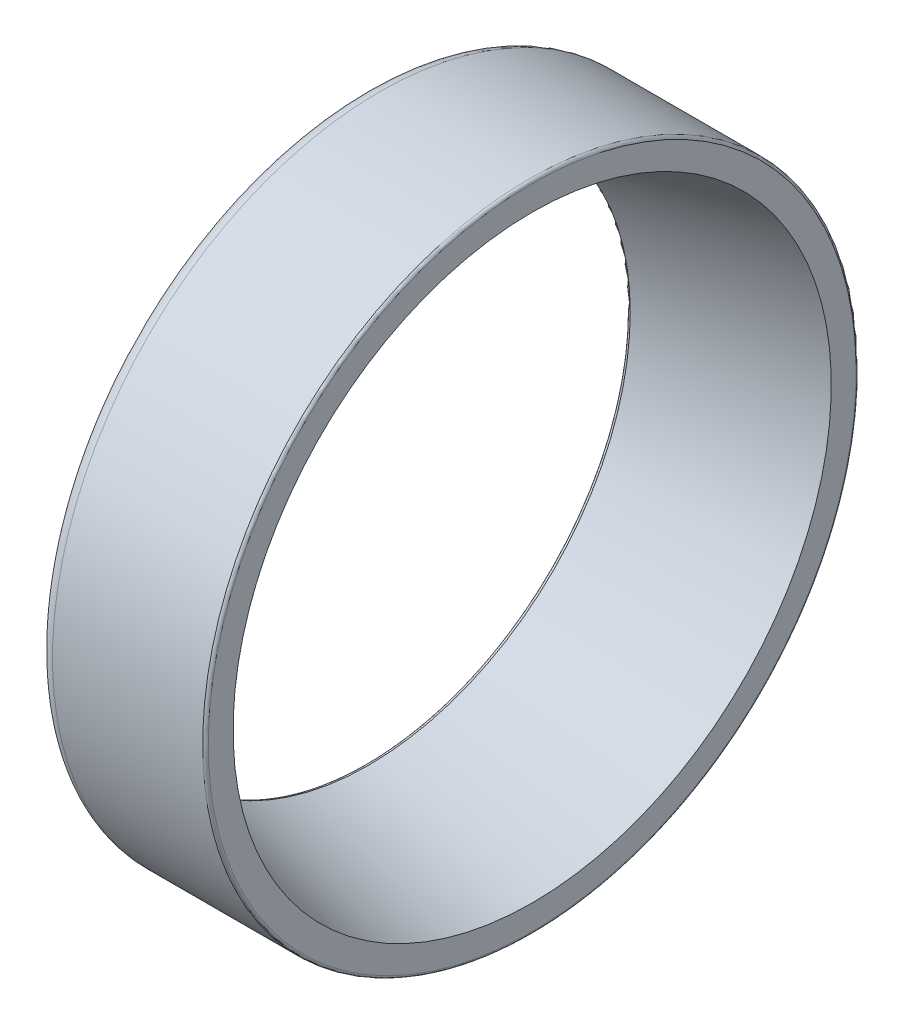
ISO-10303-21;
HEADER;
FILE_DESCRIPTION(('STEP AP214'),'2;1');
FILE_NAME('part.step','',(''),(''),'','','');
FILE_SCHEMA(('AUTOMOTIVE_DESIGN { 1 0 10303 214 1 1 1 1 }'));
ENDSEC;
DATA;
#1=APPLICATION_CONTEXT('core data for automotive mechanical design processes');
#2=APPLICATION_PROTOCOL_DEFINITION('international standard','automotive_design',2000,#1);
#3=PRODUCT_CONTEXT('',#1,'mechanical');
#4=PRODUCT('Part','Part','',(#3));
#5=PRODUCT_RELATED_PRODUCT_CATEGORY('part','',(#4));
#6=PRODUCT_DEFINITION_FORMATION('','',#4);
#7=PRODUCT_DEFINITION_CONTEXT('part definition',#1,'design');
#8=PRODUCT_DEFINITION('design','',#6,#7);
#9=PRODUCT_DEFINITION_SHAPE('','',#8);
#10=(LENGTH_UNIT() NAMED_UNIT(*) SI_UNIT(.MILLI.,.METRE.));
#11=(NAMED_UNIT(*) PLANE_ANGLE_UNIT() SI_UNIT($,.RADIAN.));
#12=(NAMED_UNIT(*) SI_UNIT($,.STERADIAN.) SOLID_ANGLE_UNIT());
#13=UNCERTAINTY_MEASURE_WITH_UNIT(LENGTH_MEASURE(1.E-05),#10,'distance_accuracy_value','');
#14=(GEOMETRIC_REPRESENTATION_CONTEXT(3) GLOBAL_UNCERTAINTY_ASSIGNED_CONTEXT((#13)) GLOBAL_UNIT_ASSIGNED_CONTEXT((#10,
#11,#12)) REPRESENTATION_CONTEXT('',''));
#15=CARTESIAN_POINT('',(0.,0.,0.));
#16=DIRECTION('',(0.,0.,1.));
#17=DIRECTION('',(1.,0.,0.));
#18=AXIS2_PLACEMENT_3D('',#15,#16,#17);
#19=CARTESIAN_POINT('',(0.2,0.,0.));
#20=DIRECTION('',(1.,0.,0.));
#21=DIRECTION('',(0.,0.,-1.));
#22=AXIS2_PLACEMENT_3D('',#19,#20,#21);
#23=TOROIDAL_SURFACE('',#22,19.0041538237628,0.2);
#24=CARTESIAN_POINT('',(0.244830339671573,0.,0.));
#25=DIRECTION('',(1.,0.,0.));
#26=DIRECTION('',(0.,1.,0.));
#27=AXIS2_PLACEMENT_3D('',#24,#25,#26);
#28=CIRCLE('',#27,18.8092429706916);
#29=CARTESIAN_POINT('',(0.244830339671573,18.8092429706916,0.));
#30=VERTEX_POINT('',#29);
#31=EDGE_CURVE('E11',#30,#30,#28,.T.);
#32=ORIENTED_EDGE('',*,*,#31,.T.);
#33=EDGE_LOOP('',(#32));
#34=FACE_BOUND('',#33,.T.);
#35=CARTESIAN_POINT('',(0.,0.,0.));
#36=DIRECTION('',(1.,0.,0.));
#37=DIRECTION('',(0.,1.,0.));
#38=AXIS2_PLACEMENT_3D('',#35,#36,#37);
#39=CIRCLE('',#38,19.0041538237628);
#40=CARTESIAN_POINT('',(0.,19.0041538237628,0.));
#41=VERTEX_POINT('',#40);
#42=EDGE_CURVE('E54',#41,#41,#39,.T.);
#43=ORIENTED_EDGE('',*,*,#42,.F.);
#44=EDGE_LOOP('',(#43));
#45=FACE_BOUND('',#44,.T.);
#46=ADVANCED_FACE('F16',(#34,#45),#23,.T.);
#47=CARTESIAN_POINT('',(6.12241516983579,0.,0.));
#48=DIRECTION('',(1.,0.,0.));
#49=DIRECTION('',(0.,1.,0.));
#50=AXIS2_PLACEMENT_3D('',#47,#48,#49);
#51=CONICAL_SURFACE('',#50,20.1611129165305,0.226072498010825);
#52=CARTESIAN_POINT('',(12.,0.,0.));
#53=DIRECTION('',(1.,0.,0.));
#54=DIRECTION('',(0.,1.,0.));
#55=AXIS2_PLACEMENT_3D('',#52,#53,#54);
#56=CIRCLE('',#55,21.5129828623694);
#57=CARTESIAN_POINT('',(12.,21.5129828623694,0.));
#58=VERTEX_POINT('',#57);
#59=EDGE_CURVE('E23',#58,#58,#56,.T.);
#60=ORIENTED_EDGE('',*,*,#59,.T.);
#61=EDGE_LOOP('',(#60));
#62=FACE_BOUND('',#61,.T.);
#63=ORIENTED_EDGE('',*,*,#31,.F.);
#64=EDGE_LOOP('',(#63));
#65=FACE_BOUND('',#64,.T.);
#66=ADVANCED_FACE('F77',(#62,#65),#51,.F.);
#67=CARTESIAN_POINT('',(12.,22.4064914311847,0.));
#68=DIRECTION('',(1.,0.,0.));
#69=DIRECTION('',(0.,1.,0.));
#70=AXIS2_PLACEMENT_3D('',#67,#68,#69);
#71=PLANE('',#70);
#72=CARTESIAN_POINT('',(12.,0.,0.));
#73=DIRECTION('',(1.,0.,0.));
#74=DIRECTION('',(0.,1.,0.));
#75=AXIS2_PLACEMENT_3D('',#72,#73,#74);
#76=CIRCLE('',#75,23.3);
#77=CARTESIAN_POINT('',(12.,23.3,0.));
#78=VERTEX_POINT('',#77);
#79=EDGE_CURVE('E51',#78,#78,#76,.T.);
#80=ORIENTED_EDGE('',*,*,#79,.T.);
#81=EDGE_LOOP('',(#80));
#82=FACE_BOUND('',#81,.T.);
#83=ORIENTED_EDGE('',*,*,#59,.F.);
#84=EDGE_LOOP('',(#83));
#85=FACE_BOUND('',#84,.T.);
#86=ADVANCED_FACE('F81',(#82,#85),#71,.T.);
#87=CARTESIAN_POINT('',(11.8,0.,0.));
#88=DIRECTION('',(1.,0.,0.));
#89=DIRECTION('',(0.,0.,-1.));
#90=AXIS2_PLACEMENT_3D('',#87,#88,#89);
#91=TOROIDAL_SURFACE('',#90,23.3,0.2);
#92=CARTESIAN_POINT('',(11.8,0.,0.));
#93=DIRECTION('',(1.,0.,0.));
#94=DIRECTION('',(0.,1.,0.));
#95=AXIS2_PLACEMENT_3D('',#92,#93,#94);
#96=CIRCLE('',#95,23.5);
#97=CARTESIAN_POINT('',(11.8,23.5,0.));
#98=VERTEX_POINT('',#97);
#99=EDGE_CURVE('E47',#98,#98,#96,.T.);
#100=ORIENTED_EDGE('',*,*,#99,.T.);
#101=EDGE_LOOP('',(#100));
#102=FACE_BOUND('',#101,.T.);
#103=ORIENTED_EDGE('',*,*,#79,.F.);
#104=EDGE_LOOP('',(#103));
#105=FACE_BOUND('',#104,.T.);
#106=ADVANCED_FACE('F48',(#102,#105),#91,.T.);
#107=CARTESIAN_POINT('',(6.4,0.,0.));
#108=DIRECTION('',(-1.,0.,0.));
#109=DIRECTION('',(0.,1.,0.));
#110=AXIS2_PLACEMENT_3D('',#107,#108,#109);
#111=CYLINDRICAL_SURFACE('',#110,23.5);
#112=CARTESIAN_POINT('',(1.,0.,0.));
#113=DIRECTION('',(1.,0.,0.));
#114=DIRECTION('',(0.,1.,0.));
#115=AXIS2_PLACEMENT_3D('',#112,#113,#114);
#116=CIRCLE('',#115,23.5);
#117=CARTESIAN_POINT('',(1.,23.5,0.));
#118=VERTEX_POINT('',#117);
#119=EDGE_CURVE('E52',#118,#118,#116,.T.);
#120=ORIENTED_EDGE('',*,*,#119,.T.);
#121=EDGE_LOOP('',(#120));
#122=FACE_BOUND('',#121,.T.);
#123=ORIENTED_EDGE('',*,*,#99,.F.);
#124=EDGE_LOOP('',(#123));
#125=FACE_BOUND('',#124,.T.);
#126=ADVANCED_FACE('F73',(#122,#125),#111,.T.);
#127=CARTESIAN_POINT('',(1.,0.,0.));
#128=DIRECTION('',(1.,0.,0.));
#129=DIRECTION('',(0.,0.,-1.));
#130=AXIS2_PLACEMENT_3D('',#127,#128,#129);
#131=TOROIDAL_SURFACE('',#130,22.5,1.);
#132=CARTESIAN_POINT('',(0.,0.,0.));
#133=DIRECTION('',(1.,0.,0.));
#134=DIRECTION('',(0.,1.,0.));
#135=AXIS2_PLACEMENT_3D('',#132,#133,#134);
#136=CIRCLE('',#135,22.5);
#137=CARTESIAN_POINT('',(0.,22.5,0.));
#138=VERTEX_POINT('',#137);
#139=EDGE_CURVE('E58',#138,#138,#136,.T.);
#140=ORIENTED_EDGE('',*,*,#139,.T.);
#141=EDGE_LOOP('',(#140));
#142=FACE_BOUND('',#141,.T.);
#143=ORIENTED_EDGE('',*,*,#119,.F.);
#144=EDGE_LOOP('',(#143));
#145=FACE_BOUND('',#144,.T.);
#146=ADVANCED_FACE('F62',(#142,#145),#131,.T.);
#147=CARTESIAN_POINT('',(0.,20.7520769118813,0.));
#148=DIRECTION('',(-1.,0.,0.));
#149=DIRECTION('',(0.,-1.,0.));
#150=AXIS2_PLACEMENT_3D('',#147,#148,#149);
#151=PLANE('',#150);
#152=ORIENTED_EDGE('',*,*,#42,.T.);
#153=EDGE_LOOP('',(#152));
#154=FACE_BOUND('',#153,.T.);
#155=ORIENTED_EDGE('',*,*,#139,.F.);
#156=EDGE_LOOP('',(#155));
#157=FACE_BOUND('',#156,.T.);
#158=ADVANCED_FACE('F65',(#154,#157),#151,.T.);
#159=CLOSED_SHELL('',(#46,#66,#86,#106,#126,#146,#158));
#160=MANIFOLD_SOLID_BREP('B1',#159);
#161=ADVANCED_BREP_SHAPE_REPRESENTATION('',(#18,#160),#14);
#162=SHAPE_DEFINITION_REPRESENTATION(#9,#161);
ENDSEC;
END-ISO-10303-21;
